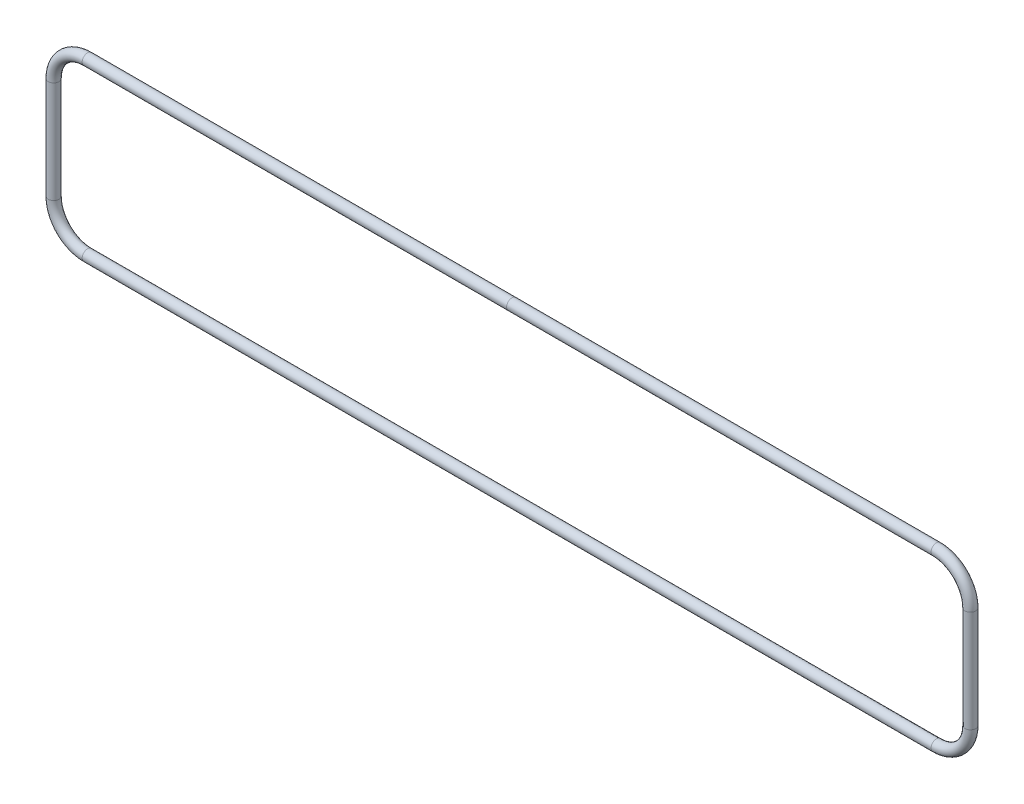
ISO-10303-21;
HEADER;
FILE_DESCRIPTION(('STEP AP214'),'2;1');
FILE_NAME('part.step','',(''),(''),'','','');
FILE_SCHEMA(('AUTOMOTIVE_DESIGN { 1 0 10303 214 1 1 1 1 }'));
ENDSEC;
DATA;
#1=APPLICATION_CONTEXT('core data for automotive mechanical design processes');
#2=APPLICATION_PROTOCOL_DEFINITION('international standard','automotive_design',2000,#1);
#3=PRODUCT_CONTEXT('',#1,'mechanical');
#4=PRODUCT('Part','Part','',(#3));
#5=PRODUCT_RELATED_PRODUCT_CATEGORY('part','',(#4));
#6=PRODUCT_DEFINITION_FORMATION('','',#4);
#7=PRODUCT_DEFINITION_CONTEXT('part definition',#1,'design');
#8=PRODUCT_DEFINITION('design','',#6,#7);
#9=PRODUCT_DEFINITION_SHAPE('','',#8);
#10=(LENGTH_UNIT() NAMED_UNIT(*) SI_UNIT(.MILLI.,.METRE.));
#11=(NAMED_UNIT(*) PLANE_ANGLE_UNIT() SI_UNIT($,.RADIAN.));
#12=(NAMED_UNIT(*) SI_UNIT($,.STERADIAN.) SOLID_ANGLE_UNIT());
#13=UNCERTAINTY_MEASURE_WITH_UNIT(LENGTH_MEASURE(1.E-05),#10,'distance_accuracy_value','');
#14=(GEOMETRIC_REPRESENTATION_CONTEXT(3) GLOBAL_UNCERTAINTY_ASSIGNED_CONTEXT((#13)) GLOBAL_UNIT_ASSIGNED_CONTEXT((#10,
#11,#12)) REPRESENTATION_CONTEXT('',''));
#15=CARTESIAN_POINT('',(0.,0.,0.));
#16=DIRECTION('',(0.,0.,1.));
#17=DIRECTION('',(1.,0.,0.));
#18=AXIS2_PLACEMENT_3D('',#15,#16,#17);
#19=CARTESIAN_POINT('',(-375.,75.,0.));
#20=DIRECTION('',(1.,0.,0.));
#21=DIRECTION('',(0.,1.,0.));
#22=AXIS2_PLACEMENT_3D('',#19,#20,#21);
#23=CYLINDRICAL_SURFACE('',#22,4.7625);
#24=CARTESIAN_POINT('',(0.,75.0000000000001,0.));
#25=DIRECTION('',(1.,0.,0.));
#26=DIRECTION('',(0.,0.,-1.));
#27=AXIS2_PLACEMENT_3D('',#24,#25,#26);
#28=CIRCLE('',#27,4.7625);
#29=CARTESIAN_POINT('',(0.,75.0000000000001,-4.7625));
#30=VERTEX_POINT('',#29);
#31=EDGE_CURVE('E64',#30,#30,#28,.T.);
#32=ORIENTED_EDGE('',*,*,#31,.F.);
#33=EDGE_LOOP('',(#32));
#34=FACE_BOUND('',#33,.T.);
#35=CARTESIAN_POINT('',(-375.,75.,0.));
#36=DIRECTION('',(1.,0.,0.));
#37=DIRECTION('',(0.,0.,-1.));
#38=AXIS2_PLACEMENT_3D('',#35,#36,#37);
#39=CIRCLE('',#38,4.7625);
#40=CARTESIAN_POINT('',(-375.,79.7625,0.));
#41=VERTEX_POINT('',#40);
#42=EDGE_CURVE('E10',#41,#41,#39,.T.);
#43=ORIENTED_EDGE('',*,*,#42,.T.);
#44=EDGE_LOOP('',(#43));
#45=FACE_BOUND('',#44,.T.);
#46=ADVANCED_FACE('F33',(#34,#45),#23,.T.);
#47=CARTESIAN_POINT('',(-375.,45.,0.));
#48=DIRECTION('',(0.,0.,-1.));
#49=DIRECTION('',(-1.,0.,0.));
#50=AXIS2_PLACEMENT_3D('',#47,#48,#49);
#51=TOROIDAL_SURFACE('',#50,30.,4.7625);
#52=CARTESIAN_POINT('',(-405.,45.,0.));
#53=DIRECTION('',(0.,1.,0.));
#54=DIRECTION('',(0.,0.,-1.));
#55=AXIS2_PLACEMENT_3D('',#52,#53,#54);
#56=CIRCLE('',#55,4.7625);
#57=CARTESIAN_POINT('',(-409.7625,44.9999999999999,0.));
#58=VERTEX_POINT('',#57);
#59=EDGE_CURVE('E39',#58,#58,#56,.T.);
#60=CARTESIAN_POINT('',(-375.,45.,0.));
#61=DIRECTION('',(0.,0.,-1.));
#62=DIRECTION('',(-1.,0.,0.));
#63=AXIS2_PLACEMENT_3D('',#60,#61,#62);
#64=CIRCLE('',#63,34.7625);
#65=EDGE_CURVE('',#58,#41,#64,.T.);
#66=ORIENTED_EDGE('',*,*,#59,.T.);
#67=ORIENTED_EDGE('',*,*,#42,.F.);
#68=ORIENTED_EDGE('',*,*,#65,.T.);
#69=ORIENTED_EDGE('',*,*,#65,.F.);
#70=EDGE_LOOP('',(#66,#68,#67,#69));
#71=FACE_BOUND('',#70,.T.);
#72=ADVANCED_FACE('F71',(#71),#51,.T.);
#73=CARTESIAN_POINT('',(-405.,-45.,0.));
#74=DIRECTION('',(0.,1.,0.));
#75=DIRECTION('',(0.,0.,1.));
#76=AXIS2_PLACEMENT_3D('',#73,#74,#75);
#77=CYLINDRICAL_SURFACE('',#76,4.7625);
#78=ORIENTED_EDGE('',*,*,#59,.F.);
#79=EDGE_LOOP('',(#78));
#80=FACE_BOUND('',#79,.T.);
#81=CARTESIAN_POINT('',(-405.,-45.,0.));
#82=DIRECTION('',(0.,1.,0.));
#83=DIRECTION('',(0.,0.,-1.));
#84=AXIS2_PLACEMENT_3D('',#81,#82,#83);
#85=CIRCLE('',#84,4.7625);
#86=CARTESIAN_POINT('',(-409.7625,-45.,0.));
#87=VERTEX_POINT('',#86);
#88=EDGE_CURVE('E43',#87,#87,#85,.T.);
#89=ORIENTED_EDGE('',*,*,#88,.T.);
#90=EDGE_LOOP('',(#89));
#91=FACE_BOUND('',#90,.T.);
#92=ADVANCED_FACE('F75',(#80,#91),#77,.T.);
#93=CARTESIAN_POINT('',(-375.,-45.,0.));
#94=DIRECTION('',(0.,0.,-1.));
#95=DIRECTION('',(-1.,0.,0.));
#96=AXIS2_PLACEMENT_3D('',#93,#94,#95);
#97=TOROIDAL_SURFACE('',#96,30.,4.7625);
#98=CARTESIAN_POINT('',(-375.,-75.,0.));
#99=DIRECTION('',(-1.,0.,0.));
#100=DIRECTION('',(0.,0.,-1.));
#101=AXIS2_PLACEMENT_3D('',#98,#99,#100);
#102=CIRCLE('',#101,4.7625);
#103=CARTESIAN_POINT('',(-375.,-79.7625,0.));
#104=VERTEX_POINT('',#103);
#105=EDGE_CURVE('E47',#104,#104,#102,.T.);
#106=CARTESIAN_POINT('',(-375.,-45.,0.));
#107=DIRECTION('',(0.,0.,-1.));
#108=DIRECTION('',(-1.,0.,0.));
#109=AXIS2_PLACEMENT_3D('',#106,#107,#108);
#110=CIRCLE('',#109,34.7625);
#111=EDGE_CURVE('',#104,#87,#110,.T.);
#112=ORIENTED_EDGE('',*,*,#105,.T.);
#113=ORIENTED_EDGE('',*,*,#88,.F.);
#114=ORIENTED_EDGE('',*,*,#111,.T.);
#115=ORIENTED_EDGE('',*,*,#111,.F.);
#116=EDGE_LOOP('',(#112,#114,#113,#115));
#117=FACE_BOUND('',#116,.T.);
#118=ADVANCED_FACE('F80',(#117),#97,.T.);
#119=CARTESIAN_POINT('',(375.,-74.9999999999999,0.));
#120=DIRECTION('',(-1.,0.,0.));
#121=DIRECTION('',(0.,-1.,0.));
#122=AXIS2_PLACEMENT_3D('',#119,#120,#121);
#123=CYLINDRICAL_SURFACE('',#122,4.7625);
#124=ORIENTED_EDGE('',*,*,#105,.F.);
#125=EDGE_LOOP('',(#124));
#126=FACE_BOUND('',#125,.T.);
#127=CARTESIAN_POINT('',(375.,-74.9999999999999,0.));
#128=DIRECTION('',(-1.,0.,0.));
#129=DIRECTION('',(0.,0.,-1.));
#130=AXIS2_PLACEMENT_3D('',#127,#128,#129);
#131=CIRCLE('',#130,4.7625);
#132=CARTESIAN_POINT('',(375.,-79.7624999999999,0.));
#133=VERTEX_POINT('',#132);
#134=EDGE_CURVE('E52',#133,#133,#131,.T.);
#135=ORIENTED_EDGE('',*,*,#134,.T.);
#136=EDGE_LOOP('',(#135));
#137=FACE_BOUND('',#136,.T.);
#138=ADVANCED_FACE('F86',(#126,#137),#123,.T.);
#139=CARTESIAN_POINT('',(375.,-44.9999999999999,0.));
#140=DIRECTION('',(0.,0.,-1.));
#141=DIRECTION('',(-1.,0.,0.));
#142=AXIS2_PLACEMENT_3D('',#139,#140,#141);
#143=TOROIDAL_SURFACE('',#142,30.,4.7625);
#144=CARTESIAN_POINT('',(405.,-44.9999999999999,0.));
#145=DIRECTION('',(0.,-1.,0.));
#146=DIRECTION('',(0.,0.,-1.));
#147=AXIS2_PLACEMENT_3D('',#144,#145,#146);
#148=CIRCLE('',#147,4.7625);
#149=CARTESIAN_POINT('',(409.7625,-44.9999999999999,0.));
#150=VERTEX_POINT('',#149);
#151=EDGE_CURVE('E55',#150,#150,#148,.T.);
#152=CARTESIAN_POINT('',(375.,-44.9999999999999,0.));
#153=DIRECTION('',(0.,0.,-1.));
#154=DIRECTION('',(-1.,0.,0.));
#155=AXIS2_PLACEMENT_3D('',#152,#153,#154);
#156=CIRCLE('',#155,34.7625);
#157=EDGE_CURVE('',#150,#133,#156,.T.);
#158=ORIENTED_EDGE('',*,*,#151,.T.);
#159=ORIENTED_EDGE('',*,*,#134,.F.);
#160=ORIENTED_EDGE('',*,*,#157,.T.);
#161=ORIENTED_EDGE('',*,*,#157,.F.);
#162=EDGE_LOOP('',(#158,#160,#159,#161));
#163=FACE_BOUND('',#162,.T.);
#164=ADVANCED_FACE('F90',(#163),#143,.T.);
#165=CARTESIAN_POINT('',(405.,45.0000000000001,0.));
#166=DIRECTION('',(0.,-1.,0.));
#167=DIRECTION('',(1.,0.,0.));
#168=AXIS2_PLACEMENT_3D('',#165,#166,#167);
#169=CYLINDRICAL_SURFACE('',#168,4.7625);
#170=CARTESIAN_POINT('',(405.,45.0000000000001,0.));
#171=DIRECTION('',(0.,-1.,0.));
#172=DIRECTION('',(0.,0.,-1.));
#173=AXIS2_PLACEMENT_3D('',#170,#171,#172);
#174=CIRCLE('',#173,4.7625);
#175=CARTESIAN_POINT('',(409.7625,45.0000000000001,0.));
#176=VERTEX_POINT('',#175);
#177=EDGE_CURVE('E58',#176,#176,#174,.T.);
#178=CARTESIAN_POINT('',(409.7625,-44.9999999999999,0.));
#179=CARTESIAN_POINT('',(409.7625,-44.0624999999999,0.));
#180=CARTESIAN_POINT('',(409.7625,-43.1249999999999,0.));
#181=CARTESIAN_POINT('',(409.7625,-41.2499999999999,0.));
#182=CARTESIAN_POINT('',(409.7625,-40.3124999999999,0.));
#183=CARTESIAN_POINT('',(409.7625,-38.4374999999999,0.));
#184=CARTESIAN_POINT('',(409.7625,-37.4999999999999,0.));
#185=CARTESIAN_POINT('',(409.7625,-35.6249999999999,0.));
#186=CARTESIAN_POINT('',(409.7625,-34.6874999999999,0.));
#187=CARTESIAN_POINT('',(409.7625,-32.8124999999999,0.));
#188=CARTESIAN_POINT('',(409.7625,-31.8749999999999,0.));
#189=CARTESIAN_POINT('',(409.7625,-29.9999999999999,0.));
#190=CARTESIAN_POINT('',(409.7625,-29.0624999999999,0.));
#191=CARTESIAN_POINT('',(409.7625,-27.1874999999999,0.));
#192=CARTESIAN_POINT('',(409.7625,-26.2499999999999,0.));
#193=CARTESIAN_POINT('',(409.7625,-24.3749999999999,0.));
#194=CARTESIAN_POINT('',(409.7625,-23.4374999999999,0.));
#195=CARTESIAN_POINT('',(409.7625,-21.5624999999999,0.));
#196=CARTESIAN_POINT('',(409.7625,-20.6249999999999,0.));
#197=CARTESIAN_POINT('',(409.7625,-18.7499999999999,0.));
#198=CARTESIAN_POINT('',(409.7625,-17.8124999999999,0.));
#199=CARTESIAN_POINT('',(409.7625,-15.9374999999999,0.));
#200=CARTESIAN_POINT('',(409.7625,-14.9999999999999,0.));
#201=CARTESIAN_POINT('',(409.7625,-13.1249999999999,0.));
#202=CARTESIAN_POINT('',(409.7625,-12.1874999999999,0.));
#203=CARTESIAN_POINT('',(409.7625,-10.3124999999999,0.));
#204=CARTESIAN_POINT('',(409.7625,-9.37499999999987,0.));
#205=CARTESIAN_POINT('',(409.7625,-7.49999999999987,0.));
#206=CARTESIAN_POINT('',(409.7625,-6.56249999999987,0.));
#207=CARTESIAN_POINT('',(409.7625,-4.68749999999987,0.));
#208=CARTESIAN_POINT('',(409.7625,-3.74999999999987,0.));
#209=CARTESIAN_POINT('',(409.7625,-1.87499999999987,0.));
#210=CARTESIAN_POINT('',(409.7625,-0.937499999999869,0.));
#211=CARTESIAN_POINT('',(409.7625,0.937500000000133,0.));
#212=CARTESIAN_POINT('',(409.7625,1.87500000000013,0.));
#213=CARTESIAN_POINT('',(409.7625,3.75000000000013,0.));
#214=CARTESIAN_POINT('',(409.7625,4.68750000000013,0.));
#215=CARTESIAN_POINT('',(409.7625,6.56250000000013,0.));
#216=CARTESIAN_POINT('',(409.7625,7.50000000000013,0.));
#217=CARTESIAN_POINT('',(409.7625,9.37500000000013,0.));
#218=CARTESIAN_POINT('',(409.7625,10.3125000000001,0.));
#219=CARTESIAN_POINT('',(409.7625,12.1875000000001,0.));
#220=CARTESIAN_POINT('',(409.7625,13.1250000000001,0.));
#221=CARTESIAN_POINT('',(409.7625,15.0000000000001,0.));
#222=CARTESIAN_POINT('',(409.7625,15.9375000000001,0.));
#223=CARTESIAN_POINT('',(409.7625,17.8125000000001,0.));
#224=CARTESIAN_POINT('',(409.7625,18.7500000000001,0.));
#225=CARTESIAN_POINT('',(409.7625,20.6250000000001,0.));
#226=CARTESIAN_POINT('',(409.7625,21.5625000000001,0.));
#227=CARTESIAN_POINT('',(409.7625,23.4375000000001,0.));
#228=CARTESIAN_POINT('',(409.7625,24.3750000000001,0.));
#229=CARTESIAN_POINT('',(409.7625,26.2500000000001,0.));
#230=CARTESIAN_POINT('',(409.7625,27.1875000000001,0.));
#231=CARTESIAN_POINT('',(409.7625,29.0625000000001,0.));
#232=CARTESIAN_POINT('',(409.7625,30.0000000000001,0.));
#233=CARTESIAN_POINT('',(409.7625,31.8750000000001,0.));
#234=CARTESIAN_POINT('',(409.7625,32.8125000000001,0.));
#235=CARTESIAN_POINT('',(409.7625,34.6875000000001,0.));
#236=CARTESIAN_POINT('',(409.7625,35.6250000000001,0.));
#237=CARTESIAN_POINT('',(409.7625,37.5000000000001,0.));
#238=CARTESIAN_POINT('',(409.7625,38.4375000000001,0.));
#239=CARTESIAN_POINT('',(409.7625,40.3125000000001,0.));
#240=CARTESIAN_POINT('',(409.7625,41.2500000000001,0.));
#241=CARTESIAN_POINT('',(409.7625,43.1250000000001,0.));
#242=CARTESIAN_POINT('',(409.7625,44.0625000000001,0.));
#243=CARTESIAN_POINT('',(409.7625,45.0000000000001,0.));
#244=B_SPLINE_CURVE_WITH_KNOTS('',3,(#178,#179,#180,#181,#182,#183,#184,#185,#186,#187,#188,
#189,#190,#191,#192,#193,#194,#195,#196,#197,#198,#199,#200,#201,#202,#203,#204,#205,#206,#207,
#208,#209,#210,#211,#212,#213,#214,#215,#216,#217,#218,#219,#220,#221,#222,#223,#224,#225,#226,
#227,#228,#229,#230,#231,#232,#233,#234,#235,#236,#237,#238,#239,#240,#241,#242,#243),
.UNSPECIFIED.,.F.,.F.,(4,2,2,2,2,2,2,2,2,2,2,2,2,2,2,2,2,2,2,2,2,2,2,2,2,2,2,2,2,2,2,2,4),(0.,
2.8125,5.62500000000001,8.4375,11.25,14.0625,16.875,19.6875,22.5,25.3125,28.125,30.9375,33.75,
36.5625,39.375,42.1875,45.,47.8125,50.625,53.4375,56.25,59.0625,61.875,64.6875,67.5,70.3125,
73.125,75.9375,78.75,81.5625,84.375,87.1875,90.),.UNSPECIFIED.);
#245=EDGE_CURVE('BSEAM94',#150,#176,#244,.T.);
#246=ORIENTED_EDGE('',*,*,#151,.F.);
#247=ORIENTED_EDGE('',*,*,#177,.T.);
#248=ORIENTED_EDGE('',*,*,#245,.T.);
#249=ORIENTED_EDGE('',*,*,#245,.F.);
#250=EDGE_LOOP('',(#246,#248,#247,#249));
#251=FACE_BOUND('',#250,.T.);
#252=ADVANCED_FACE('F94',(#251),#169,.T.);
#253=CARTESIAN_POINT('',(375.,45.0000000000001,0.));
#254=DIRECTION('',(0.,0.,-1.));
#255=DIRECTION('',(-1.,0.,0.));
#256=AXIS2_PLACEMENT_3D('',#253,#254,#255);
#257=TOROIDAL_SURFACE('',#256,30.,4.7625);
#258=CARTESIAN_POINT('',(375.,75.0000000000001,0.));
#259=DIRECTION('',(1.,0.,0.));
#260=DIRECTION('',(0.,0.,-1.));
#261=AXIS2_PLACEMENT_3D('',#258,#259,#260);
#262=CIRCLE('',#261,4.7625);
#263=CARTESIAN_POINT('',(375.,79.7625000000001,0.));
#264=VERTEX_POINT('',#263);
#265=EDGE_CURVE('E61',#264,#264,#262,.T.);
#266=CARTESIAN_POINT('',(375.,45.0000000000001,0.));
#267=DIRECTION('',(0.,0.,-1.));
#268=DIRECTION('',(-1.,0.,0.));
#269=AXIS2_PLACEMENT_3D('',#266,#267,#268);
#270=CIRCLE('',#269,34.7625);
#271=EDGE_CURVE('',#264,#176,#270,.T.);
#272=ORIENTED_EDGE('',*,*,#265,.T.);
#273=ORIENTED_EDGE('',*,*,#177,.F.);
#274=ORIENTED_EDGE('',*,*,#271,.T.);
#275=ORIENTED_EDGE('',*,*,#271,.F.);
#276=EDGE_LOOP('',(#272,#274,#273,#275));
#277=FACE_BOUND('',#276,.T.);
#278=ADVANCED_FACE('F98',(#277),#257,.T.);
#279=CARTESIAN_POINT('',(0.,75.0000000000001,0.));
#280=DIRECTION('',(1.,0.,0.));
#281=DIRECTION('',(0.,1.,0.));
#282=AXIS2_PLACEMENT_3D('',#279,#280,#281);
#283=CYLINDRICAL_SURFACE('',#282,4.7625);
#284=ORIENTED_EDGE('',*,*,#265,.F.);
#285=EDGE_LOOP('',(#284));
#286=FACE_BOUND('',#285,.T.);
#287=ORIENTED_EDGE('',*,*,#31,.T.);
#288=EDGE_LOOP('',(#287));
#289=FACE_BOUND('',#288,.T.);
#290=ADVANCED_FACE('F68',(#286,#289),#283,.T.);
#291=CLOSED_SHELL('',(#46,#72,#92,#118,#138,#164,#252,#278,#290));
#292=MANIFOLD_SOLID_BREP('B2',#291);
#293=ADVANCED_BREP_SHAPE_REPRESENTATION('',(#18,#292),#14);
#294=SHAPE_DEFINITION_REPRESENTATION(#9,#293);
ENDSEC;
END-ISO-10303-21;
